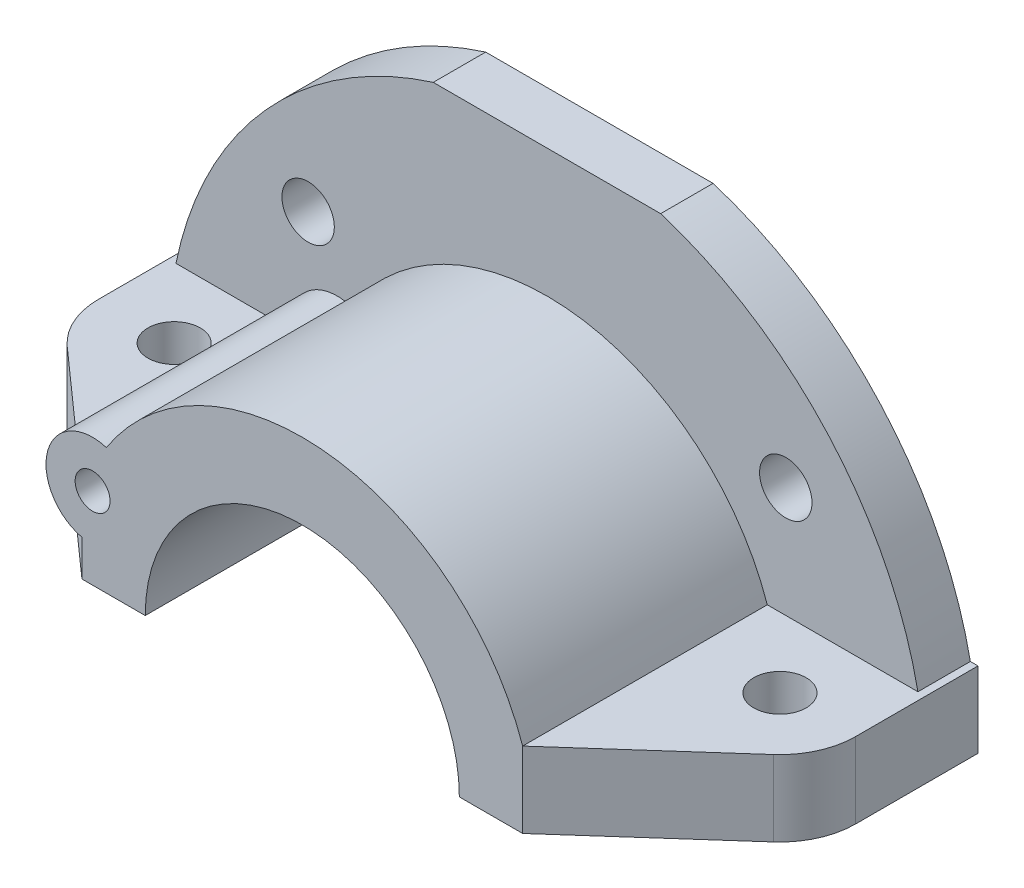
ISO-10303-21;
HEADER;
FILE_DESCRIPTION(('STEP AP214'),'2;1');
FILE_NAME('part.step','',(''),(''),'','','');
FILE_SCHEMA(('AUTOMOTIVE_DESIGN { 1 0 10303 214 1 1 1 1 }'));
ENDSEC;
DATA;
#1=APPLICATION_CONTEXT('core data for automotive mechanical design processes');
#2=APPLICATION_PROTOCOL_DEFINITION('international standard','automotive_design',2000,#1);
#3=PRODUCT_CONTEXT('',#1,'mechanical');
#4=PRODUCT('Part','Part','',(#3));
#5=PRODUCT_RELATED_PRODUCT_CATEGORY('part','',(#4));
#6=PRODUCT_DEFINITION_FORMATION('','',#4);
#7=PRODUCT_DEFINITION_CONTEXT('part definition',#1,'design');
#8=PRODUCT_DEFINITION('design','',#6,#7);
#9=PRODUCT_DEFINITION_SHAPE('','',#8);
#10=(LENGTH_UNIT() NAMED_UNIT(*) SI_UNIT(.MILLI.,.METRE.));
#11=(NAMED_UNIT(*) PLANE_ANGLE_UNIT() SI_UNIT($,.RADIAN.));
#12=(NAMED_UNIT(*) SI_UNIT($,.STERADIAN.) SOLID_ANGLE_UNIT());
#13=UNCERTAINTY_MEASURE_WITH_UNIT(LENGTH_MEASURE(1.E-05),#10,'distance_accuracy_value','');
#14=(GEOMETRIC_REPRESENTATION_CONTEXT(3) GLOBAL_UNCERTAINTY_ASSIGNED_CONTEXT((#13)) GLOBAL_UNIT_ASSIGNED_CONTEXT((#10,
#11,#12)) REPRESENTATION_CONTEXT('',''));
#15=CARTESIAN_POINT('',(0.,0.,0.));
#16=DIRECTION('',(0.,0.,1.));
#17=DIRECTION('',(1.,0.,0.));
#18=AXIS2_PLACEMENT_3D('',#15,#16,#17);
#19=CARTESIAN_POINT('',(0.,13.,51.));
#20=DIRECTION('',(0.,1.,0.));
#21=DIRECTION('',(-1.,0.,0.));
#22=AXIS2_PLACEMENT_3D('',#19,#20,#21);
#23=PLANE('',#22);
#24=DIRECTION('',(0.,0.,1.));
#25=VECTOR('',#24,1.);
#26=CARTESIAN_POINT('',(-43.9372539331938,13.,0.));
#27=LINE('',#26,#25);
#28=CARTESIAN_POINT('',(-43.9372539331938,13.,9.));
#29=VERTEX_POINT('',#28);
#30=CARTESIAN_POINT('',(-43.937253933194,13.0000000000018,45.5674390370011));
#31=VERTEX_POINT('',#30);
#32=EDGE_CURVE('E91',#29,#31,#27,.T.);
#33=ORIENTED_EDGE('',*,*,#32,.F.);
#34=DIRECTION('',(1.,0.,0.));
#35=VECTOR('',#34,1.);
#36=CARTESIAN_POINT('',(0.,13.,9.));
#37=LINE('',#36,#35);
#38=CARTESIAN_POINT('',(-63.6867333123626,13.,9.));
#39=VERTEX_POINT('',#38);
#40=EDGE_CURVE('E327',#39,#29,#37,.T.);
#41=ORIENTED_EDGE('',*,*,#40,.F.);
#42=DIRECTION('',(0.,0.,-1.));
#43=VECTOR('',#42,1.);
#44=CARTESIAN_POINT('',(-63.6867333123626,13.,9.));
#45=LINE('',#44,#43);
#46=CARTESIAN_POINT('',(-63.6867333123626,13.,0.));
#47=VERTEX_POINT('',#46);
#48=EDGE_CURVE('E338',#39,#47,#45,.T.);
#49=ORIENTED_EDGE('',*,*,#48,.T.);
#50=DIRECTION('',(1.,0.,0.));
#51=VECTOR('',#50,1.);
#52=CARTESIAN_POINT('',(0.,13.,0.));
#53=LINE('',#52,#51);
#54=CARTESIAN_POINT('',(-65.,13.,0.));
#55=VERTEX_POINT('',#54);
#56=EDGE_CURVE('E264',#55,#47,#53,.T.);
#57=ORIENTED_EDGE('',*,*,#56,.F.);
#58=DIRECTION('',(0.,0.,-1.));
#59=VECTOR('',#58,1.);
#60=CARTESIAN_POINT('',(-65.,13.,51.));
#61=LINE('',#60,#59);
#62=CARTESIAN_POINT('',(-64.9999999999989,13.0000000000027,21.));
#63=VERTEX_POINT('',#62);
#64=EDGE_CURVE('E306',#63,#55,#61,.T.);
#65=ORIENTED_EDGE('',*,*,#64,.F.);
#66=CARTESIAN_POINT('',(-52.,13.0000000000021,21.));
#67=DIRECTION('',(0.,1.,0.));
#68=DIRECTION('',(-1.,0.,0.));
#69=AXIS2_PLACEMENT_3D('',#66,#67,#68);
#70=CIRCLE('',#69,12.9999999999991);
#71=CARTESIAN_POINT('',(-60.6390494366861,13.0000000000025,30.7142588410271));
#72=VERTEX_POINT('',#71);
#73=EDGE_CURVE('E231',#72,#63,#70,.F.);
#74=ORIENTED_EDGE('',*,*,#73,.F.);
#75=DIRECTION('',(-0.747250680079011,0.,-0.664542264360556));
#76=VECTOR('',#75,1.);
#77=CARTESIAN_POINT('',(-42.0312761736802,13.0000000000017,47.2624562646792));
#78=LINE('',#77,#76);
#79=EDGE_CURVE('E228',#31,#72,#78,.T.);
#80=ORIENTED_EDGE('',*,*,#79,.F.);
#81=EDGE_LOOP('',(#33,#41,#49,#57,#65,#74,#80));
#82=FACE_BOUND('',#81,.T.);
#83=CARTESIAN_POINT('',(-52.,13.0000000000021,21.));
#84=DIRECTION('',(0.,1.,0.));
#85=DIRECTION('',(-1.,0.,0.));
#86=AXIS2_PLACEMENT_3D('',#83,#84,#85);
#87=CIRCLE('',#86,4.5);
#88=CARTESIAN_POINT('',(-56.5,13.0000000000023,21.));
#89=VERTEX_POINT('',#88);
#90=EDGE_CURVE('E226',#89,#89,#87,.F.);
#91=ORIENTED_EDGE('',*,*,#90,.T.);
#92=EDGE_LOOP('',(#91));
#93=FACE_BOUND('',#92,.T.);
#94=ADVANCED_FACE('F75',(#82,#93),#23,.T.);
#95=CARTESIAN_POINT('',(0.,13.,51.));
#96=DIRECTION('',(0.,1.,0.));
#97=DIRECTION('',(0.,0.,1.));
#98=AXIS2_PLACEMENT_3D('',#95,#96,#97);
#99=PLANE('',#98);
#100=CARTESIAN_POINT('',(52.,12.9999999999979,21.));
#101=DIRECTION('',(0.,1.,0.));
#102=DIRECTION('',(-1.,0.,0.));
#103=AXIS2_PLACEMENT_3D('',#100,#101,#102);
#104=CIRCLE('',#103,4.5);
#105=CARTESIAN_POINT('',(47.5,12.999999999998,21.));
#106=VERTEX_POINT('',#105);
#107=EDGE_CURVE('E214',#106,#106,#104,.T.);
#108=ORIENTED_EDGE('',*,*,#107,.F.);
#109=EDGE_LOOP('',(#108));
#110=FACE_BOUND('',#109,.T.);
#111=DIRECTION('',(0.747250680079012,0.,-0.664542264360556));
#112=VECTOR('',#111,1.);
#113=CARTESIAN_POINT('',(42.0312761736813,12.9999999999983,47.2624562646793));
#114=LINE('',#113,#112);
#115=CARTESIAN_POINT('',(37.8285606387551,13.0000000000011,51.));
#116=VERTEX_POINT('',#115);
#117=CARTESIAN_POINT('',(60.6390494366873,12.9999999999975,30.714258841027));
#118=VERTEX_POINT('',#117);
#119=EDGE_CURVE('E198',#116,#118,#114,.T.);
#120=ORIENTED_EDGE('',*,*,#119,.T.);
#121=CARTESIAN_POINT('',(52.,12.9999999999979,21.));
#122=DIRECTION('',(0.,1.,0.));
#123=DIRECTION('',(-1.,0.,0.));
#124=AXIS2_PLACEMENT_3D('',#121,#122,#123);
#125=CIRCLE('',#124,13.);
#126=CARTESIAN_POINT('',(65.,12.9999999999973,21.));
#127=VERTEX_POINT('',#126);
#128=EDGE_CURVE('E208',#118,#127,#125,.T.);
#129=ORIENTED_EDGE('',*,*,#128,.T.);
#130=DIRECTION('',(0.,0.,-1.));
#131=VECTOR('',#130,1.);
#132=CARTESIAN_POINT('',(65.,13.,51.));
#133=LINE('',#132,#131);
#134=CARTESIAN_POINT('',(65.,13.,0.));
#135=VERTEX_POINT('',#134);
#136=EDGE_CURVE('E291',#127,#135,#133,.T.);
#137=ORIENTED_EDGE('',*,*,#136,.T.);
#138=DIRECTION('',(1.,0.,0.));
#139=VECTOR('',#138,1.);
#140=CARTESIAN_POINT('',(0.,13.,0.));
#141=LINE('',#140,#139);
#142=CARTESIAN_POINT('',(63.6867333123626,13.,0.));
#143=VERTEX_POINT('',#142);
#144=EDGE_CURVE('E256',#143,#135,#141,.T.);
#145=ORIENTED_EDGE('',*,*,#144,.F.);
#146=DIRECTION('',(0.,0.,-1.));
#147=VECTOR('',#146,1.);
#148=CARTESIAN_POINT('',(63.6867333123626,13.,9.));
#149=LINE('',#148,#147);
#150=CARTESIAN_POINT('',(63.6867333123626,13.,9.));
#151=VERTEX_POINT('',#150);
#152=EDGE_CURVE('E365',#151,#143,#149,.T.);
#153=ORIENTED_EDGE('',*,*,#152,.F.);
#154=DIRECTION('',(1.,0.,0.));
#155=VECTOR('',#154,1.);
#156=CARTESIAN_POINT('',(5.33736863353878E-13,13.0000000000026,9.));
#157=LINE('',#156,#155);
#158=CARTESIAN_POINT('',(37.8285606387551,13.0000000000011,9.));
#159=VERTEX_POINT('',#158);
#160=EDGE_CURVE('E313',#159,#151,#157,.T.);
#161=ORIENTED_EDGE('',*,*,#160,.F.);
#162=DIRECTION('',(0.,0.,-1.));
#163=VECTOR('',#162,1.);
#164=CARTESIAN_POINT('',(37.8285606387551,13.0000000000011,51.));
#165=LINE('',#164,#163);
#166=EDGE_CURVE('E220',#116,#159,#165,.T.);
#167=ORIENTED_EDGE('',*,*,#166,.F.);
#168=EDGE_LOOP('',(#120,#129,#137,#145,#153,#161,#167));
#169=FACE_BOUND('',#168,.T.);
#170=ADVANCED_FACE('F217',(#110,#169),#99,.T.);
#171=CARTESIAN_POINT('',(0.,0.,51.));
#172=DIRECTION('',(0.,1.,0.));
#173=DIRECTION('',(0.,0.,1.));
#174=AXIS2_PLACEMENT_3D('',#171,#172,#173);
#175=PLANE('',#174);
#176=CARTESIAN_POINT('',(-52.0000000000005,0.,21.));
#177=DIRECTION('',(0.,1.,0.));
#178=DIRECTION('',(0.,0.,1.));
#179=AXIS2_PLACEMENT_3D('',#176,#177,#178);
#180=CIRCLE('',#179,4.5);
#181=CARTESIAN_POINT('',(-52.0000000000005,0.,25.5));
#182=VERTEX_POINT('',#181);
#183=EDGE_CURVE('E269',#182,#182,#180,.F.);
#184=ORIENTED_EDGE('',*,*,#183,.F.);
#185=EDGE_LOOP('',(#184));
#186=FACE_BOUND('',#185,.T.);
#187=DIRECTION('',(1.,0.,0.));
#188=VECTOR('',#187,1.);
#189=CARTESIAN_POINT('',(0.,0.,51.));
#190=LINE('',#189,#188);
#191=CARTESIAN_POINT('',(-37.8285606387538,0.,51.));
#192=VERTEX_POINT('',#191);
#193=CARTESIAN_POINT('',(-26.9625,0.,51.));
#194=VERTEX_POINT('',#193);
#195=EDGE_CURVE('E255',#192,#194,#190,.T.);
#196=ORIENTED_EDGE('',*,*,#195,.F.);
#197=DIRECTION('',(-0.747250680079011,0.,-0.664542264360556));
#198=VECTOR('',#197,1.);
#199=CARTESIAN_POINT('',(-16.7057135654625,0.,69.7848937418734));
#200=LINE('',#199,#198);
#201=CARTESIAN_POINT('',(-60.6390494366867,0.,30.7142588410271));
#202=VERTEX_POINT('',#201);
#203=EDGE_CURVE('E239',#192,#202,#200,.T.);
#204=ORIENTED_EDGE('',*,*,#203,.T.);
#205=CARTESIAN_POINT('',(-52.0000000000005,0.,21.));
#206=DIRECTION('',(0.,1.,0.));
#207=DIRECTION('',(0.,0.,1.));
#208=AXIS2_PLACEMENT_3D('',#205,#206,#207);
#209=CIRCLE('',#208,12.9999999999991);
#210=CARTESIAN_POINT('',(-64.9999999999995,0.,21.));
#211=VERTEX_POINT('',#210);
#212=EDGE_CURVE('E84',#202,#211,#209,.F.);
#213=ORIENTED_EDGE('',*,*,#212,.T.);
#214=DIRECTION('',(0.,0.,-1.));
#215=VECTOR('',#214,1.);
#216=CARTESIAN_POINT('',(-65.,0.,51.));
#217=LINE('',#216,#215);
#218=CARTESIAN_POINT('',(-65.,0.,0.));
#219=VERTEX_POINT('',#218);
#220=EDGE_CURVE('E303',#211,#219,#217,.T.);
#221=ORIENTED_EDGE('',*,*,#220,.T.);
#222=DIRECTION('',(1.,0.,0.));
#223=VECTOR('',#222,1.);
#224=CARTESIAN_POINT('',(0.,0.,0.));
#225=LINE('',#224,#223);
#226=CARTESIAN_POINT('',(-26.9625,0.,0.));
#227=VERTEX_POINT('',#226);
#228=EDGE_CURVE('E273',#219,#227,#225,.T.);
#229=ORIENTED_EDGE('',*,*,#228,.T.);
#230=DIRECTION('',(0.,0.,-1.));
#231=VECTOR('',#230,1.);
#232=CARTESIAN_POINT('',(-26.9625,0.,51.));
#233=LINE('',#232,#231);
#234=EDGE_CURVE('E300',#194,#227,#233,.T.);
#235=ORIENTED_EDGE('',*,*,#234,.F.);
#236=EDGE_LOOP('',(#196,#204,#213,#221,#229,#235));
#237=FACE_BOUND('',#236,.T.);
#238=ADVANCED_FACE('F386',(#186,#237),#175,.F.);
#239=CARTESIAN_POINT('',(51.9999999999995,0.,21.));
#240=DIRECTION('',(0.,1.,0.));
#241=DIRECTION('',(0.,0.,1.));
#242=AXIS2_PLACEMENT_3D('',#239,#240,#241);
#243=CIRCLE('',#242,4.5);
#244=CARTESIAN_POINT('',(51.9999999999995,0.,25.5));
#245=VERTEX_POINT('',#244);
#246=EDGE_CURVE('E251',#245,#245,#243,.T.);
#247=ORIENTED_EDGE('',*,*,#246,.T.);
#248=EDGE_LOOP('',(#247));
#249=FACE_BOUND('',#248,.T.);
#250=CARTESIAN_POINT('',(51.9999999999995,0.,21.));
#251=DIRECTION('',(0.,1.,0.));
#252=DIRECTION('',(0.,0.,1.));
#253=AXIS2_PLACEMENT_3D('',#250,#251,#252);
#254=CIRCLE('',#253,13.);
#255=CARTESIAN_POINT('',(60.6390494366868,0.,30.714258841027));
#256=VERTEX_POINT('',#255);
#257=CARTESIAN_POINT('',(64.9999999999995,0.,21.));
#258=VERTEX_POINT('',#257);
#259=EDGE_CURVE('E248',#256,#258,#254,.T.);
#260=ORIENTED_EDGE('',*,*,#259,.F.);
#261=DIRECTION('',(0.747250680079012,0.,-0.664542264360556));
#262=VECTOR('',#261,1.);
#263=CARTESIAN_POINT('',(16.7057135654625,0.,69.7848937418734));
#264=LINE('',#263,#262);
#265=CARTESIAN_POINT('',(37.8285606387546,0.,51.));
#266=VERTEX_POINT('',#265);
#267=EDGE_CURVE('E201',#266,#256,#264,.T.);
#268=ORIENTED_EDGE('',*,*,#267,.F.);
#269=CARTESIAN_POINT('',(26.9625,0.,51.));
#270=VERTEX_POINT('',#269);
#271=EDGE_CURVE('E260',#270,#266,#190,.T.);
#272=ORIENTED_EDGE('',*,*,#271,.F.);
#273=DIRECTION('',(0.,0.,-1.));
#274=VECTOR('',#273,1.);
#275=CARTESIAN_POINT('',(26.9625,0.,51.));
#276=LINE('',#275,#274);
#277=CARTESIAN_POINT('',(26.9625,0.,0.));
#278=VERTEX_POINT('',#277);
#279=EDGE_CURVE('E297',#270,#278,#276,.T.);
#280=ORIENTED_EDGE('',*,*,#279,.T.);
#281=CARTESIAN_POINT('',(65.,0.,0.));
#282=VERTEX_POINT('',#281);
#283=EDGE_CURVE('E278',#278,#282,#225,.T.);
#284=ORIENTED_EDGE('',*,*,#283,.T.);
#285=DIRECTION('',(0.,0.,-1.));
#286=VECTOR('',#285,1.);
#287=CARTESIAN_POINT('',(65.,0.,51.));
#288=LINE('',#287,#286);
#289=EDGE_CURVE('E294',#258,#282,#288,.T.);
#290=ORIENTED_EDGE('',*,*,#289,.F.);
#291=EDGE_LOOP('',(#260,#268,#272,#280,#284,#290));
#292=FACE_BOUND('',#291,.T.);
#293=ADVANCED_FACE('F389',(#249,#292),#175,.F.);
#294=CARTESIAN_POINT('',(65.,0.,51.));
#295=DIRECTION('',(-1.,0.,0.));
#296=DIRECTION('',(0.,0.,1.));
#297=AXIS2_PLACEMENT_3D('',#294,#295,#296);
#298=PLANE('',#297);
#299=DIRECTION('',(0.,1.,0.));
#300=VECTOR('',#299,1.);
#301=CARTESIAN_POINT('',(64.9999999999979,-38.0000000000027,21.));
#302=LINE('',#301,#300);
#303=EDGE_CURVE('E205',#258,#127,#302,.T.);
#304=ORIENTED_EDGE('',*,*,#303,.F.);
#305=ORIENTED_EDGE('',*,*,#289,.T.);
#306=DIRECTION('',(0.,1.,0.));
#307=VECTOR('',#306,1.);
#308=CARTESIAN_POINT('',(65.,0.,0.));
#309=LINE('',#308,#307);
#310=EDGE_CURVE('E282',#282,#135,#309,.T.);
#311=ORIENTED_EDGE('',*,*,#310,.T.);
#312=ORIENTED_EDGE('',*,*,#136,.F.);
#313=EDGE_LOOP('',(#304,#305,#311,#312));
#314=FACE_BOUND('',#313,.T.);
#315=ADVANCED_FACE('F495',(#314),#298,.F.);
#316=CARTESIAN_POINT('',(0.,0.,51.));
#317=DIRECTION('',(0.,0.,1.));
#318=DIRECTION('',(1.,0.,0.));
#319=AXIS2_PLACEMENT_3D('',#316,#317,#318);
#320=PLANE('',#319);
#321=CARTESIAN_POINT('',(-36.,14.,51.));
#322=DIRECTION('',(0.,0.,1.));
#323=DIRECTION('',(1.,0.,0.));
#324=AXIS2_PLACEMENT_3D('',#321,#322,#323);
#325=CIRCLE('',#324,3.);
#326=CARTESIAN_POINT('',(-33.,14.,51.));
#327=VERTEX_POINT('',#326);
#328=EDGE_CURVE('E759',#327,#327,#325,.T.);
#329=ORIENTED_EDGE('',*,*,#328,.F.);
#330=EDGE_LOOP('',(#329));
#331=FACE_BOUND('',#330,.T.);
#332=CARTESIAN_POINT('',(0.,0.,51.));
#333=DIRECTION('',(0.,0.,1.));
#334=DIRECTION('',(1.,0.,0.));
#335=AXIS2_PLACEMENT_3D('',#332,#333,#334);
#336=CIRCLE('',#335,40.);
#337=CARTESIAN_POINT('',(-33.6386188705644,21.6435514756915,51.));
#338=VERTEX_POINT('',#337);
#339=EDGE_CURVE('E252',#116,#338,#336,.T.);
#340=ORIENTED_EDGE('',*,*,#339,.T.);
#341=CARTESIAN_POINT('',(-36.,14.,51.));
#342=DIRECTION('',(0.,0.,1.));
#343=DIRECTION('',(1.,0.,0.));
#344=AXIS2_PLACEMENT_3D('',#341,#342,#343);
#345=CIRCLE('',#344,8.);
#346=CARTESIAN_POINT('',(-37.8285606387538,6.21178030674529,51.));
#347=VERTEX_POINT('',#346);
#348=EDGE_CURVE('E400',#338,#347,#345,.T.);
#349=ORIENTED_EDGE('',*,*,#348,.T.);
#350=DIRECTION('',(0.,1.,0.));
#351=VECTOR('',#350,1.);
#352=CARTESIAN_POINT('',(-37.828560638754,1.55311517696281E-12,51.));
#353=LINE('',#352,#351);
#354=EDGE_CURVE('E369',#192,#347,#353,.T.);
#355=ORIENTED_EDGE('',*,*,#354,.F.);
#356=ORIENTED_EDGE('',*,*,#195,.T.);
#357=CARTESIAN_POINT('',(0.,0.,51.));
#358=DIRECTION('',(0.,0.,1.));
#359=DIRECTION('',(1.,0.,0.));
#360=AXIS2_PLACEMENT_3D('',#357,#358,#359);
#361=CIRCLE('',#360,26.9625);
#362=EDGE_CURVE('E259',#270,#194,#361,.T.);
#363=ORIENTED_EDGE('',*,*,#362,.F.);
#364=ORIENTED_EDGE('',*,*,#271,.T.);
#365=DIRECTION('',(0.,1.,0.));
#366=VECTOR('',#365,1.);
#367=CARTESIAN_POINT('',(37.828560638754,-1.55311517696281E-12,51.));
#368=LINE('',#367,#366);
#369=EDGE_CURVE('E372',#266,#116,#368,.T.);
#370=ORIENTED_EDGE('',*,*,#369,.T.);
#371=EDGE_LOOP('',(#340,#349,#355,#356,#363,#364,#370));
#372=FACE_BOUND('',#371,.T.);
#373=ADVANCED_FACE('F396',(#331,#372),#320,.T.);
#374=CARTESIAN_POINT('',(0.,0.,9.));
#375=DIRECTION('',(0.,0.,-1.));
#376=DIRECTION('',(-1.,0.,0.));
#377=AXIS2_PLACEMENT_3D('',#374,#375,#376);
#378=CYLINDRICAL_SURFACE('',#377,65.);
#379=CARTESIAN_POINT('',(0.,0.,0.));
#380=DIRECTION('',(0.,0.,1.));
#381=DIRECTION('',(1.,0.,0.));
#382=AXIS2_PLACEMENT_3D('',#379,#380,#381);
#383=CIRCLE('',#382,65.);
#384=CARTESIAN_POINT('',(19.5192212959432,62.,0.));
#385=VERTEX_POINT('',#384);
#386=EDGE_CURVE('E309',#143,#385,#383,.T.);
#387=ORIENTED_EDGE('',*,*,#386,.T.);
#388=DIRECTION('',(0.,0.,-1.));
#389=VECTOR('',#388,1.);
#390=CARTESIAN_POINT('',(19.5192212959432,62.,9.));
#391=LINE('',#390,#389);
#392=CARTESIAN_POINT('',(19.5192212959432,62.,9.));
#393=VERTEX_POINT('',#392);
#394=EDGE_CURVE('E362',#393,#385,#391,.T.);
#395=ORIENTED_EDGE('',*,*,#394,.F.);
#396=CARTESIAN_POINT('',(0.,0.,9.));
#397=DIRECTION('',(0.,0.,1.));
#398=DIRECTION('',(1.,0.,0.));
#399=AXIS2_PLACEMENT_3D('',#396,#397,#398);
#400=CIRCLE('',#399,65.);
#401=EDGE_CURVE('E317',#151,#393,#400,.T.);
#402=ORIENTED_EDGE('',*,*,#401,.F.);
#403=ORIENTED_EDGE('',*,*,#152,.T.);
#404=EDGE_LOOP('',(#387,#395,#402,#403));
#405=FACE_BOUND('',#404,.T.);
#406=ADVANCED_FACE('F77',(#405),#378,.T.);
#407=CARTESIAN_POINT('',(0.,62.,9.));
#408=DIRECTION('',(0.,1.,0.));
#409=DIRECTION('',(0.,0.,1.));
#410=AXIS2_PLACEMENT_3D('',#407,#408,#409);
#411=PLANE('',#410);
#412=DIRECTION('',(1.,0.,0.));
#413=VECTOR('',#412,1.);
#414=CARTESIAN_POINT('',(0.,62.,0.));
#415=LINE('',#414,#413);
#416=CARTESIAN_POINT('',(-19.5192212959432,62.,0.));
#417=VERTEX_POINT('',#416);
#418=EDGE_CURVE('E342',#417,#385,#415,.T.);
#419=ORIENTED_EDGE('',*,*,#418,.F.);
#420=DIRECTION('',(0.,0.,-1.));
#421=VECTOR('',#420,1.);
#422=CARTESIAN_POINT('',(-19.5192212959432,62.,9.));
#423=LINE('',#422,#421);
#424=CARTESIAN_POINT('',(-19.5192212959432,62.,9.));
#425=VERTEX_POINT('',#424);
#426=EDGE_CURVE('E359',#425,#417,#423,.T.);
#427=ORIENTED_EDGE('',*,*,#426,.F.);
#428=DIRECTION('',(1.,0.,0.));
#429=VECTOR('',#428,1.);
#430=CARTESIAN_POINT('',(0.,62.,9.));
#431=LINE('',#430,#429);
#432=EDGE_CURVE('E320',#425,#393,#431,.T.);
#433=ORIENTED_EDGE('',*,*,#432,.T.);
#434=ORIENTED_EDGE('',*,*,#394,.T.);
#435=EDGE_LOOP('',(#419,#427,#433,#434));
#436=FACE_BOUND('',#435,.T.);
#437=ADVANCED_FACE('F471',(#436),#411,.T.);
#438=CARTESIAN_POINT('',(0.,0.,9.));
#439=DIRECTION('',(0.,0.,-1.));
#440=DIRECTION('',(-1.,0.,0.));
#441=AXIS2_PLACEMENT_3D('',#438,#439,#440);
#442=CYLINDRICAL_SURFACE('',#441,65.);
#443=CARTESIAN_POINT('',(0.,0.,0.));
#444=DIRECTION('',(0.,0.,1.));
#445=DIRECTION('',(1.,0.,0.));
#446=AXIS2_PLACEMENT_3D('',#443,#444,#445);
#447=CIRCLE('',#446,65.);
#448=EDGE_CURVE('E346',#417,#47,#447,.T.);
#449=ORIENTED_EDGE('',*,*,#448,.T.);
#450=ORIENTED_EDGE('',*,*,#48,.F.);
#451=CARTESIAN_POINT('',(0.,0.,9.));
#452=DIRECTION('',(0.,0.,1.));
#453=DIRECTION('',(1.,0.,0.));
#454=AXIS2_PLACEMENT_3D('',#451,#452,#453);
#455=CIRCLE('',#454,65.);
#456=EDGE_CURVE('E324',#425,#39,#455,.T.);
#457=ORIENTED_EDGE('',*,*,#456,.F.);
#458=ORIENTED_EDGE('',*,*,#426,.T.);
#459=EDGE_LOOP('',(#449,#450,#457,#458));
#460=FACE_BOUND('',#459,.T.);
#461=ADVANCED_FACE('F468',(#460),#442,.T.);
#462=CARTESIAN_POINT('',(41.,32.,9.));
#463=DIRECTION('',(0.,0.,-1.));
#464=DIRECTION('',(-1.,0.,0.));
#465=AXIS2_PLACEMENT_3D('',#462,#463,#464);
#466=CYLINDRICAL_SURFACE('',#465,4.5);
#467=CARTESIAN_POINT('',(41.,32.,9.));
#468=DIRECTION('',(0.,0.,1.));
#469=DIRECTION('',(1.,0.,0.));
#470=AXIS2_PLACEMENT_3D('',#467,#468,#469);
#471=CIRCLE('',#470,4.5);
#472=CARTESIAN_POINT('',(45.5,32.,9.));
#473=VERTEX_POINT('',#472);
#474=EDGE_CURVE('E330',#473,#473,#471,.T.);
#475=ORIENTED_EDGE('',*,*,#474,.T.);
#476=EDGE_LOOP('',(#475));
#477=FACE_BOUND('',#476,.T.);
#478=CARTESIAN_POINT('',(41.,32.,0.));
#479=DIRECTION('',(0.,0.,1.));
#480=DIRECTION('',(1.,0.,0.));
#481=AXIS2_PLACEMENT_3D('',#478,#479,#480);
#482=CIRCLE('',#481,4.5);
#483=CARTESIAN_POINT('',(45.5,32.,0.));
#484=VERTEX_POINT('',#483);
#485=EDGE_CURVE('E349',#484,#484,#482,.T.);
#486=ORIENTED_EDGE('',*,*,#485,.F.);
#487=EDGE_LOOP('',(#486));
#488=FACE_BOUND('',#487,.T.);
#489=ADVANCED_FACE('F464',(#477,#488),#466,.F.);
#490=CARTESIAN_POINT('',(-41.,32.,9.));
#491=DIRECTION('',(0.,0.,-1.));
#492=DIRECTION('',(-1.,0.,0.));
#493=AXIS2_PLACEMENT_3D('',#490,#491,#492);
#494=CYLINDRICAL_SURFACE('',#493,4.5);
#495=CARTESIAN_POINT('',(-41.,32.,9.));
#496=DIRECTION('',(0.,0.,1.));
#497=DIRECTION('',(1.,0.,0.));
#498=AXIS2_PLACEMENT_3D('',#495,#496,#497);
#499=CIRCLE('',#498,4.5);
#500=CARTESIAN_POINT('',(-36.5,32.,9.));
#501=VERTEX_POINT('',#500);
#502=EDGE_CURVE('E334',#501,#501,#499,.F.);
#503=ORIENTED_EDGE('',*,*,#502,.F.);
#504=EDGE_LOOP('',(#503));
#505=FACE_BOUND('',#504,.T.);
#506=CARTESIAN_POINT('',(-41.,32.,0.));
#507=DIRECTION('',(0.,0.,1.));
#508=DIRECTION('',(1.,0.,0.));
#509=AXIS2_PLACEMENT_3D('',#506,#507,#508);
#510=CIRCLE('',#509,4.5);
#511=CARTESIAN_POINT('',(-36.5,32.,0.));
#512=VERTEX_POINT('',#511);
#513=EDGE_CURVE('E314',#512,#512,#510,.F.);
#514=ORIENTED_EDGE('',*,*,#513,.T.);
#515=EDGE_LOOP('',(#514));
#516=FACE_BOUND('',#515,.T.);
#517=ADVANCED_FACE('F457',(#505,#516),#494,.F.);
#518=CARTESIAN_POINT('',(0.,0.,9.));
#519=DIRECTION('',(0.,0.,1.));
#520=DIRECTION('',(1.,0.,0.));
#521=AXIS2_PLACEMENT_3D('',#518,#519,#520);
#522=PLANE('',#521);
#523=CARTESIAN_POINT('',(-36.,14.,9.));
#524=DIRECTION('',(0.,0.,1.));
#525=DIRECTION('',(1.,0.,0.));
#526=AXIS2_PLACEMENT_3D('',#523,#524,#525);
#527=CIRCLE('',#526,8.);
#528=CARTESIAN_POINT('',(-33.6386188705644,21.6435514756915,9.));
#529=VERTEX_POINT('',#528);
#530=EDGE_CURVE('E408',#529,#29,#527,.T.);
#531=ORIENTED_EDGE('',*,*,#530,.F.);
#532=CARTESIAN_POINT('',(0.,0.,9.));
#533=DIRECTION('',(0.,0.,1.));
#534=DIRECTION('',(1.,0.,0.));
#535=AXIS2_PLACEMENT_3D('',#532,#533,#534);
#536=CIRCLE('',#535,40.);
#537=EDGE_CURVE('E310',#159,#529,#536,.T.);
#538=ORIENTED_EDGE('',*,*,#537,.F.);
#539=ORIENTED_EDGE('',*,*,#160,.T.);
#540=ORIENTED_EDGE('',*,*,#401,.T.);
#541=ORIENTED_EDGE('',*,*,#432,.F.);
#542=ORIENTED_EDGE('',*,*,#456,.T.);
#543=ORIENTED_EDGE('',*,*,#40,.T.);
#544=EDGE_LOOP('',(#531,#538,#539,#540,#541,#542,#543));
#545=FACE_BOUND('',#544,.T.);
#546=ORIENTED_EDGE('',*,*,#474,.F.);
#547=EDGE_LOOP('',(#546));
#548=FACE_BOUND('',#547,.T.);
#549=ORIENTED_EDGE('',*,*,#502,.T.);
#550=EDGE_LOOP('',(#549));
#551=FACE_BOUND('',#550,.T.);
#552=ADVANCED_FACE('F454',(#545,#548,#551),#522,.T.);
#553=CARTESIAN_POINT('',(0.,0.,0.));
#554=DIRECTION('',(0.,0.,1.));
#555=DIRECTION('',(1.,0.,0.));
#556=AXIS2_PLACEMENT_3D('',#553,#554,#555);
#557=PLANE('',#556);
#558=ORIENTED_EDGE('',*,*,#56,.T.);
#559=ORIENTED_EDGE('',*,*,#448,.F.);
#560=ORIENTED_EDGE('',*,*,#418,.T.);
#561=ORIENTED_EDGE('',*,*,#386,.F.);
#562=ORIENTED_EDGE('',*,*,#144,.T.);
#563=ORIENTED_EDGE('',*,*,#310,.F.);
#564=ORIENTED_EDGE('',*,*,#283,.F.);
#565=CARTESIAN_POINT('',(0.,0.,0.));
#566=DIRECTION('',(0.,0.,1.));
#567=DIRECTION('',(1.,0.,0.));
#568=AXIS2_PLACEMENT_3D('',#565,#566,#567);
#569=CIRCLE('',#568,26.9625);
#570=EDGE_CURVE('E277',#278,#227,#569,.T.);
#571=ORIENTED_EDGE('',*,*,#570,.T.);
#572=ORIENTED_EDGE('',*,*,#228,.F.);
#573=DIRECTION('',(0.,1.,0.));
#574=VECTOR('',#573,1.);
#575=CARTESIAN_POINT('',(-65.,0.,0.));
#576=LINE('',#575,#574);
#577=EDGE_CURVE('E268',#219,#55,#576,.T.);
#578=ORIENTED_EDGE('',*,*,#577,.T.);
#579=EDGE_LOOP('',(#558,#559,#560,#561,#562,#563,#564,#571,#572,#578));
#580=FACE_BOUND('',#579,.T.);
#581=ORIENTED_EDGE('',*,*,#485,.T.);
#582=EDGE_LOOP('',(#581));
#583=FACE_BOUND('',#582,.T.);
#584=ORIENTED_EDGE('',*,*,#513,.F.);
#585=EDGE_LOOP('',(#584));
#586=FACE_BOUND('',#585,.T.);
#587=ADVANCED_FACE('F453',(#580,#583,#586),#557,.F.);
#588=CARTESIAN_POINT('',(0.,0.,51.));
#589=DIRECTION('',(0.,0.,-1.));
#590=DIRECTION('',(-1.,0.,0.));
#591=AXIS2_PLACEMENT_3D('',#588,#589,#590);
#592=CYLINDRICAL_SURFACE('',#591,40.);
#593=ORIENTED_EDGE('',*,*,#537,.T.);
#594=DIRECTION('',(0.,0.,1.));
#595=VECTOR('',#594,1.);
#596=CARTESIAN_POINT('',(-33.6386188705644,21.6435514756915,25.5));
#597=LINE('',#596,#595);
#598=EDGE_CURVE('E99',#529,#338,#597,.T.);
#599=ORIENTED_EDGE('',*,*,#598,.T.);
#600=ORIENTED_EDGE('',*,*,#339,.F.);
#601=ORIENTED_EDGE('',*,*,#166,.T.);
#602=EDGE_LOOP('',(#593,#599,#600,#601));
#603=FACE_BOUND('',#602,.T.);
#604=ADVANCED_FACE('F450',(#603),#592,.T.);
#605=CARTESIAN_POINT('',(-65.,0.,51.));
#606=DIRECTION('',(-1.,0.,0.));
#607=DIRECTION('',(0.,0.,1.));
#608=AXIS2_PLACEMENT_3D('',#605,#606,#607);
#609=PLANE('',#608);
#610=DIRECTION('',(0.,1.,0.));
#611=VECTOR('',#610,1.);
#612=CARTESIAN_POINT('',(-65.000000000001,-37.9999999999973,21.));
#613=LINE('',#612,#611);
#614=EDGE_CURVE('E235',#211,#63,#613,.T.);
#615=ORIENTED_EDGE('',*,*,#614,.T.);
#616=ORIENTED_EDGE('',*,*,#64,.T.);
#617=ORIENTED_EDGE('',*,*,#577,.F.);
#618=ORIENTED_EDGE('',*,*,#220,.F.);
#619=EDGE_LOOP('',(#615,#616,#617,#618));
#620=FACE_BOUND('',#619,.T.);
#621=ADVANCED_FACE('F448',(#620),#609,.T.);
#622=CARTESIAN_POINT('',(0.,0.,51.));
#623=DIRECTION('',(0.,0.,-1.));
#624=DIRECTION('',(-1.,0.,0.));
#625=AXIS2_PLACEMENT_3D('',#622,#623,#624);
#626=CYLINDRICAL_SURFACE('',#625,26.9625);
#627=ORIENTED_EDGE('',*,*,#570,.F.);
#628=ORIENTED_EDGE('',*,*,#279,.F.);
#629=ORIENTED_EDGE('',*,*,#362,.T.);
#630=ORIENTED_EDGE('',*,*,#234,.T.);
#631=EDGE_LOOP('',(#627,#628,#629,#630));
#632=FACE_BOUND('',#631,.T.);
#633=ADVANCED_FACE('F505',(#632),#626,.F.);
#634=CARTESIAN_POINT('',(-52.0000000000021,-37.9999999999979,21.));
#635=DIRECTION('',(0.,1.,0.));
#636=DIRECTION('',(-1.,0.,0.));
#637=AXIS2_PLACEMENT_3D('',#634,#635,#636);
#638=CYLINDRICAL_SURFACE('',#637,12.9999999999991);
#639=DIRECTION('',(0.,1.,0.));
#640=VECTOR('',#639,1.);
#641=CARTESIAN_POINT('',(-60.6390494366882,-37.9999999999975,30.7142588410271));
#642=LINE('',#641,#640);
#643=EDGE_CURVE('E234',#202,#72,#642,.T.);
#644=ORIENTED_EDGE('',*,*,#643,.T.);
#645=ORIENTED_EDGE('',*,*,#73,.T.);
#646=ORIENTED_EDGE('',*,*,#614,.F.);
#647=ORIENTED_EDGE('',*,*,#212,.F.);
#648=EDGE_LOOP('',(#644,#645,#646,#647));
#649=FACE_BOUND('',#648,.T.);
#650=ADVANCED_FACE('F511',(#649),#638,.T.);
#651=CARTESIAN_POINT('',(-42.0312761736823,-37.9999999999983,47.2624562646792));
#652=DIRECTION('',(0.664542264360556,0.,-0.747250680079011));
#653=DIRECTION('',(-0.747250680079011,0.,-0.664542264360556));
#654=AXIS2_PLACEMENT_3D('',#651,#652,#653);
#655=PLANE('',#654);
#656=ORIENTED_EDGE('',*,*,#354,.T.);
#657=CARTESIAN_POINT('',(-36.,14.,52.626168914653));
#658=DIRECTION('',(0.664542264360556,0.,-0.747250680079011));
#659=DIRECTION('',(0.747250680079011,0.,0.664542264360556));
#660=AXIS2_PLACEMENT_3D('',#657,#658,#659);
#661=ELLIPSE('',#660,10.7059119693998,8.);
#662=EDGE_CURVE('E12',#347,#31,#661,.T.);
#663=ORIENTED_EDGE('',*,*,#662,.T.);
#664=ORIENTED_EDGE('',*,*,#79,.T.);
#665=ORIENTED_EDGE('',*,*,#643,.F.);
#666=ORIENTED_EDGE('',*,*,#203,.F.);
#667=EDGE_LOOP('',(#656,#663,#664,#665,#666));
#668=FACE_BOUND('',#667,.T.);
#669=ADVANCED_FACE('F403',(#668),#655,.F.);
#670=CARTESIAN_POINT('',(51.9999999999979,-38.0000000000021,21.));
#671=DIRECTION('',(0.,1.,0.));
#672=DIRECTION('',(-1.,0.,0.));
#673=AXIS2_PLACEMENT_3D('',#670,#671,#672);
#674=CYLINDRICAL_SURFACE('',#673,13.);
#675=ORIENTED_EDGE('',*,*,#259,.T.);
#676=ORIENTED_EDGE('',*,*,#303,.T.);
#677=ORIENTED_EDGE('',*,*,#128,.F.);
#678=DIRECTION('',(0.,1.,0.));
#679=VECTOR('',#678,1.);
#680=CARTESIAN_POINT('',(60.6390494366852,-38.0000000000025,30.714258841027));
#681=LINE('',#680,#679);
#682=EDGE_CURVE('E194',#256,#118,#681,.T.);
#683=ORIENTED_EDGE('',*,*,#682,.F.);
#684=EDGE_LOOP('',(#675,#676,#677,#683));
#685=FACE_BOUND('',#684,.T.);
#686=ADVANCED_FACE('F209',(#685),#674,.T.);
#687=CARTESIAN_POINT('',(42.0312761736792,-38.0000000000017,47.2624562646793));
#688=DIRECTION('',(0.664542264360556,0.,0.747250680079012));
#689=DIRECTION('',(0.747250680079012,0.,-0.664542264360556));
#690=AXIS2_PLACEMENT_3D('',#687,#688,#689);
#691=PLANE('',#690);
#692=ORIENTED_EDGE('',*,*,#267,.T.);
#693=ORIENTED_EDGE('',*,*,#682,.T.);
#694=ORIENTED_EDGE('',*,*,#119,.F.);
#695=ORIENTED_EDGE('',*,*,#369,.F.);
#696=EDGE_LOOP('',(#692,#693,#694,#695));
#697=FACE_BOUND('',#696,.T.);
#698=ADVANCED_FACE('F196',(#697),#691,.T.);
#699=CARTESIAN_POINT('',(51.9999999999979,-38.0000000000021,21.));
#700=DIRECTION('',(0.,1.,0.));
#701=DIRECTION('',(-1.,0.,0.));
#702=AXIS2_PLACEMENT_3D('',#699,#700,#701);
#703=CYLINDRICAL_SURFACE('',#702,4.5);
#704=ORIENTED_EDGE('',*,*,#107,.T.);
#705=EDGE_LOOP('',(#704));
#706=FACE_BOUND('',#705,.T.);
#707=ORIENTED_EDGE('',*,*,#246,.F.);
#708=EDGE_LOOP('',(#707));
#709=FACE_BOUND('',#708,.T.);
#710=ADVANCED_FACE('F428',(#706,#709),#703,.F.);
#711=CARTESIAN_POINT('',(-52.0000000000021,-37.9999999999979,21.));
#712=DIRECTION('',(0.,1.,0.));
#713=DIRECTION('',(-1.,0.,0.));
#714=AXIS2_PLACEMENT_3D('',#711,#712,#713);
#715=CYLINDRICAL_SURFACE('',#714,4.5);
#716=ORIENTED_EDGE('',*,*,#90,.F.);
#717=EDGE_LOOP('',(#716));
#718=FACE_BOUND('',#717,.T.);
#719=ORIENTED_EDGE('',*,*,#183,.T.);
#720=EDGE_LOOP('',(#719));
#721=FACE_BOUND('',#720,.T.);
#722=ADVANCED_FACE('F384',(#718,#721),#715,.F.);
#723=CARTESIAN_POINT('',(-36.,14.,0.));
#724=DIRECTION('',(0.,0.,1.));
#725=DIRECTION('',(1.,0.,0.));
#726=AXIS2_PLACEMENT_3D('',#723,#724,#725);
#727=CYLINDRICAL_SURFACE('',#726,8.);
#728=ORIENTED_EDGE('',*,*,#598,.F.);
#729=ORIENTED_EDGE('',*,*,#530,.T.);
#730=ORIENTED_EDGE('',*,*,#32,.T.);
#731=ORIENTED_EDGE('',*,*,#662,.F.);
#732=ORIENTED_EDGE('',*,*,#348,.F.);
#733=EDGE_LOOP('',(#728,#729,#730,#731,#732));
#734=FACE_BOUND('',#733,.T.);
#735=ADVANCED_FACE('F406',(#734),#727,.T.);
#736=CARTESIAN_POINT('',(-36.,14.,38.));
#737=DIRECTION('',(0.,0.,1.));
#738=DIRECTION('',(1.,0.,0.));
#739=AXIS2_PLACEMENT_3D('',#736,#737,#738);
#740=CYLINDRICAL_SURFACE('',#739,3.);
#741=CARTESIAN_POINT('',(-36.,14.,38.));
#742=DIRECTION('',(0.,0.,1.));
#743=DIRECTION('',(1.,0.,0.));
#744=AXIS2_PLACEMENT_3D('',#741,#742,#743);
#745=CIRCLE('',#744,3.);
#746=CARTESIAN_POINT('',(-33.,14.,38.));
#747=VERTEX_POINT('',#746);
#748=EDGE_CURVE('E414',#747,#747,#745,.T.);
#749=CARTESIAN_POINT('',(-33.,14.,38.));
#750=CARTESIAN_POINT('',(-33.,14.,38.1354166666667));
#751=CARTESIAN_POINT('',(-33.,14.,38.2708333333333));
#752=CARTESIAN_POINT('',(-33.,14.,38.5416666666667));
#753=CARTESIAN_POINT('',(-33.,14.,38.6770833333333));
#754=CARTESIAN_POINT('',(-33.,14.,38.9479166666667));
#755=CARTESIAN_POINT('',(-33.,14.,39.0833333333333));
#756=CARTESIAN_POINT('',(-33.,14.,39.3541666666667));
#757=CARTESIAN_POINT('',(-33.,14.,39.4895833333333));
#758=CARTESIAN_POINT('',(-33.,14.,39.7604166666667));
#759=CARTESIAN_POINT('',(-33.,14.,39.8958333333333));
#760=CARTESIAN_POINT('',(-33.,14.,40.1666666666667));
#761=CARTESIAN_POINT('',(-33.,14.,40.3020833333333));
#762=CARTESIAN_POINT('',(-33.,14.,40.5729166666667));
#763=CARTESIAN_POINT('',(-33.,14.,40.7083333333333));
#764=CARTESIAN_POINT('',(-33.,14.,40.9791666666667));
#765=CARTESIAN_POINT('',(-33.,14.,41.1145833333333));
#766=CARTESIAN_POINT('',(-33.,14.,41.3854166666667));
#767=CARTESIAN_POINT('',(-33.,14.,41.5208333333333));
#768=CARTESIAN_POINT('',(-33.,14.,41.7916666666667));
#769=CARTESIAN_POINT('',(-33.,14.,41.9270833333333));
#770=CARTESIAN_POINT('',(-33.,14.,42.1979166666667));
#771=CARTESIAN_POINT('',(-33.,14.,42.3333333333333));
#772=CARTESIAN_POINT('',(-33.,14.,42.6041666666667));
#773=CARTESIAN_POINT('',(-33.,14.,42.7395833333333));
#774=CARTESIAN_POINT('',(-33.,14.,43.0104166666667));
#775=CARTESIAN_POINT('',(-33.,14.,43.1458333333333));
#776=CARTESIAN_POINT('',(-33.,14.,43.4166666666667));
#777=CARTESIAN_POINT('',(-33.,14.,43.5520833333333));
#778=CARTESIAN_POINT('',(-33.,14.,43.8229166666667));
#779=CARTESIAN_POINT('',(-33.,14.,43.9583333333333));
#780=CARTESIAN_POINT('',(-33.,14.,44.2291666666667));
#781=CARTESIAN_POINT('',(-33.,14.,44.3645833333333));
#782=CARTESIAN_POINT('',(-33.,14.,44.6354166666667));
#783=CARTESIAN_POINT('',(-33.,14.,44.7708333333333));
#784=CARTESIAN_POINT('',(-33.,14.,45.0416666666667));
#785=CARTESIAN_POINT('',(-33.,14.,45.1770833333333));
#786=CARTESIAN_POINT('',(-33.,14.,45.4479166666667));
#787=CARTESIAN_POINT('',(-33.,14.,45.5833333333333));
#788=CARTESIAN_POINT('',(-33.,14.,45.8541666666667));
#789=CARTESIAN_POINT('',(-33.,14.,45.9895833333333));
#790=CARTESIAN_POINT('',(-33.,14.,46.2604166666667));
#791=CARTESIAN_POINT('',(-33.,14.,46.3958333333333));
#792=CARTESIAN_POINT('',(-33.,14.,46.6666666666667));
#793=CARTESIAN_POINT('',(-33.,14.,46.8020833333333));
#794=CARTESIAN_POINT('',(-33.,14.,47.0729166666667));
#795=CARTESIAN_POINT('',(-33.,14.,47.2083333333333));
#796=CARTESIAN_POINT('',(-33.,14.,47.4791666666667));
#797=CARTESIAN_POINT('',(-33.,14.,47.6145833333333));
#798=CARTESIAN_POINT('',(-33.,14.,47.8854166666667));
#799=CARTESIAN_POINT('',(-33.,14.,48.0208333333333));
#800=CARTESIAN_POINT('',(-33.,14.,48.2916666666667));
#801=CARTESIAN_POINT('',(-33.,14.,48.4270833333333));
#802=CARTESIAN_POINT('',(-33.,14.,48.6979166666667));
#803=CARTESIAN_POINT('',(-33.,14.,48.8333333333333));
#804=CARTESIAN_POINT('',(-33.,14.,49.1041666666667));
#805=CARTESIAN_POINT('',(-33.,14.,49.2395833333333));
#806=CARTESIAN_POINT('',(-33.,14.,49.5104166666667));
#807=CARTESIAN_POINT('',(-33.,14.,49.6458333333333));
#808=CARTESIAN_POINT('',(-33.,14.,49.9166666666667));
#809=CARTESIAN_POINT('',(-33.,14.,50.0520833333333));
#810=CARTESIAN_POINT('',(-33.,14.,50.3229166666667));
#811=CARTESIAN_POINT('',(-33.,14.,50.4583333333333));
#812=CARTESIAN_POINT('',(-33.,14.,50.7291666666667));
#813=CARTESIAN_POINT('',(-33.,14.,50.8645833333333));
#814=CARTESIAN_POINT('',(-33.,14.,51.));
#815=B_SPLINE_CURVE_WITH_KNOTS('',3,(#749,#750,#751,#752,#753,#754,#755,#756,#757,#758,#759,
#760,#761,#762,#763,#764,#765,#766,#767,#768,#769,#770,#771,#772,#773,#774,#775,#776,#777,#778,
#779,#780,#781,#782,#783,#784,#785,#786,#787,#788,#789,#790,#791,#792,#793,#794,#795,#796,#797,
#798,#799,#800,#801,#802,#803,#804,#805,#806,#807,#808,#809,#810,#811,#812,#813,#814),
.UNSPECIFIED.,.F.,.F.,(4,2,2,2,2,2,2,2,2,2,2,2,2,2,2,2,2,2,2,2,2,2,2,2,2,2,2,2,2,2,2,2,4),(0.,
0.406249999999997,0.812499999999994,1.21875,1.62499999999999,2.03125,2.4375,2.84375,3.25,
3.65624999999999,4.0625,4.46874999999999,4.875,5.28124999999999,5.6875,6.09374999999999,6.5,
6.90625,7.31249999999999,7.71875,8.12499999999999,8.53125,8.93749999999999,9.34375,
9.74999999999999,10.15625,10.5625,10.96875,11.375,11.78125,12.1875,12.59375,13.),.UNSPECIFIED.);
#816=EDGE_CURVE('BSEAM434',#747,#327,#815,.T.);
#817=ORIENTED_EDGE('',*,*,#748,.F.);
#818=ORIENTED_EDGE('',*,*,#328,.T.);
#819=ORIENTED_EDGE('',*,*,#816,.T.);
#820=ORIENTED_EDGE('',*,*,#816,.F.);
#821=EDGE_LOOP('',(#817,#819,#818,#820));
#822=FACE_BOUND('',#821,.T.);
#823=ADVANCED_FACE('F434',(#822),#740,.F.);
#824=CARTESIAN_POINT('',(0.,0.,38.));
#825=DIRECTION('',(0.,0.,1.));
#826=DIRECTION('',(1.,0.,0.));
#827=AXIS2_PLACEMENT_3D('',#824,#825,#826);
#828=PLANE('',#827);
#829=ORIENTED_EDGE('',*,*,#748,.T.);
#830=EDGE_LOOP('',(#829));
#831=FACE_BOUND('',#830,.T.);
#832=ADVANCED_FACE('F728',(#831),#828,.T.);
#833=CLOSED_SHELL('',(#94,#170,#238,#293,#315,#373,#406,#437,#461,#489,#517,#552,#587,#604,#621,
#633,#650,#669,#686,#698,#710,#722,#735,#823,#832));
#834=MANIFOLD_SOLID_BREP('B2',#833);
#835=ADVANCED_BREP_SHAPE_REPRESENTATION('',(#18,#834),#14);
#836=SHAPE_DEFINITION_REPRESENTATION(#9,#835);
ENDSEC;
END-ISO-10303-21;
